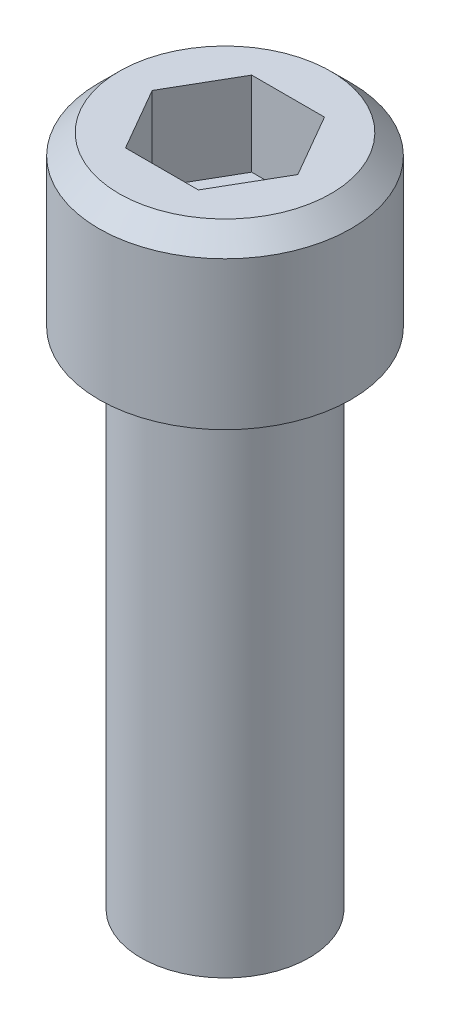
ISO-10303-21;
HEADER;
FILE_DESCRIPTION(('STEP AP214'),'2;1');
FILE_NAME('part.step','',(''),(''),'','','');
FILE_SCHEMA(('AUTOMOTIVE_DESIGN { 1 0 10303 214 1 1 1 1 }'));
ENDSEC;
DATA;
#1=APPLICATION_CONTEXT('core data for automotive mechanical design processes');
#2=APPLICATION_PROTOCOL_DEFINITION('international standard','automotive_design',2000,#1);
#3=PRODUCT_CONTEXT('',#1,'mechanical');
#4=PRODUCT('Part','Part','',(#3));
#5=PRODUCT_RELATED_PRODUCT_CATEGORY('part','',(#4));
#6=PRODUCT_DEFINITION_FORMATION('','',#4);
#7=PRODUCT_DEFINITION_CONTEXT('part definition',#1,'design');
#8=PRODUCT_DEFINITION('design','',#6,#7);
#9=PRODUCT_DEFINITION_SHAPE('','',#8);
#10=(LENGTH_UNIT() NAMED_UNIT(*) SI_UNIT(.MILLI.,.METRE.));
#11=(NAMED_UNIT(*) PLANE_ANGLE_UNIT() SI_UNIT($,.RADIAN.));
#12=(NAMED_UNIT(*) SI_UNIT($,.STERADIAN.) SOLID_ANGLE_UNIT());
#13=UNCERTAINTY_MEASURE_WITH_UNIT(LENGTH_MEASURE(1.E-05),#10,'distance_accuracy_value','');
#14=(GEOMETRIC_REPRESENTATION_CONTEXT(3) GLOBAL_UNCERTAINTY_ASSIGNED_CONTEXT((#13)) GLOBAL_UNIT_ASSIGNED_CONTEXT((#10,
#11,#12)) REPRESENTATION_CONTEXT('',''));
#15=CARTESIAN_POINT('',(0.,0.,0.));
#16=DIRECTION('',(0.,0.,1.));
#17=DIRECTION('',(1.,0.,0.));
#18=AXIS2_PLACEMENT_3D('',#15,#16,#17);
#19=CARTESIAN_POINT('',(0.,0.,0.));
#20=DIRECTION('',(0.,-1.,0.));
#21=DIRECTION('',(0.,0.,-1.));
#22=AXIS2_PLACEMENT_3D('',#19,#20,#21);
#23=CYLINDRICAL_SURFACE('',#22,9.525);
#24=CARTESIAN_POINT('',(0.,11.176,0.));
#25=DIRECTION('',(0.,1.,0.));
#26=DIRECTION('',(0.,0.,1.));
#27=AXIS2_PLACEMENT_3D('',#24,#25,#26);
#28=CIRCLE('',#27,9.525);
#29=CARTESIAN_POINT('',(0.,11.176,9.525));
#30=VERTEX_POINT('',#29);
#31=EDGE_CURVE('E42',#30,#30,#28,.F.);
#32=ORIENTED_EDGE('',*,*,#31,.T.);
#33=EDGE_LOOP('',(#32));
#34=FACE_BOUND('',#33,.T.);
#35=CARTESIAN_POINT('',(0.,0.,0.));
#36=DIRECTION('',(0.,-1.,0.));
#37=DIRECTION('',(0.,0.,-1.));
#38=AXIS2_PLACEMENT_3D('',#35,#36,#37);
#39=CIRCLE('',#38,9.525);
#40=CARTESIAN_POINT('',(0.,0.,-9.525));
#41=VERTEX_POINT('',#40);
#42=EDGE_CURVE('E137',#41,#41,#39,.T.);
#43=ORIENTED_EDGE('',*,*,#42,.F.);
#44=EDGE_LOOP('',(#43));
#45=FACE_BOUND('',#44,.T.);
#46=ADVANCED_FACE('F34',(#34,#45),#23,.T.);
#47=CARTESIAN_POINT('',(9.525,12.7,0.));
#48=DIRECTION('',(0.,1.,0.));
#49=DIRECTION('',(0.,0.,1.));
#50=AXIS2_PLACEMENT_3D('',#47,#48,#49);
#51=PLANE('',#50);
#52=CARTESIAN_POINT('',(0.,12.7,0.));
#53=DIRECTION('',(0.,1.,0.));
#54=DIRECTION('',(0.,0.,1.));
#55=AXIS2_PLACEMENT_3D('',#52,#53,#54);
#56=CIRCLE('',#55,8.00099999999999);
#57=CARTESIAN_POINT('',(0.,12.7,8.00099999999999));
#58=VERTEX_POINT('',#57);
#59=EDGE_CURVE('E11',#58,#58,#56,.T.);
#60=ORIENTED_EDGE('',*,*,#59,.T.);
#61=EDGE_LOOP('',(#60));
#62=FACE_BOUND('',#61,.T.);
#63=DIRECTION('',(1.,0.,0.));
#64=VECTOR('',#63,1.);
#65=CARTESIAN_POINT('',(-2.74963065701559,12.7,4.7625));
#66=LINE('',#65,#64);
#67=CARTESIAN_POINT('',(-2.74963065701559,12.7,4.7625));
#68=VERTEX_POINT('',#67);
#69=CARTESIAN_POINT('',(2.74963065701559,12.7,4.7625));
#70=VERTEX_POINT('',#69);
#71=EDGE_CURVE('E49',#68,#70,#66,.T.);
#72=ORIENTED_EDGE('',*,*,#71,.F.);
#73=DIRECTION('',(0.5,0.,0.866025403784439));
#74=VECTOR('',#73,1.);
#75=CARTESIAN_POINT('',(-5.49926131403118,12.7,0.));
#76=LINE('',#75,#74);
#77=CARTESIAN_POINT('',(-5.49926131403118,12.7,0.));
#78=VERTEX_POINT('',#77);
#79=EDGE_CURVE('E133',#78,#68,#76,.T.);
#80=ORIENTED_EDGE('',*,*,#79,.F.);
#81=DIRECTION('',(0.5,0.,-0.866025403784439));
#82=VECTOR('',#81,1.);
#83=CARTESIAN_POINT('',(-5.49926131403118,12.7,0.));
#84=LINE('',#83,#82);
#85=CARTESIAN_POINT('',(-2.74963065701559,12.7,-4.7625));
#86=VERTEX_POINT('',#85);
#87=EDGE_CURVE('E131',#78,#86,#84,.T.);
#88=ORIENTED_EDGE('',*,*,#87,.T.);
#89=DIRECTION('',(1.,0.,0.));
#90=VECTOR('',#89,1.);
#91=CARTESIAN_POINT('',(-2.74963065701559,12.7,-4.7625));
#92=LINE('',#91,#90);
#93=CARTESIAN_POINT('',(2.74963065701559,12.7,-4.7625));
#94=VERTEX_POINT('',#93);
#95=EDGE_CURVE('E108',#86,#94,#92,.T.);
#96=ORIENTED_EDGE('',*,*,#95,.T.);
#97=DIRECTION('',(-0.5,0.,-0.866025403784439));
#98=VECTOR('',#97,1.);
#99=CARTESIAN_POINT('',(5.49926131403118,12.7,0.));
#100=LINE('',#99,#98);
#101=CARTESIAN_POINT('',(5.49926131403118,12.7,0.));
#102=VERTEX_POINT('',#101);
#103=EDGE_CURVE('E127',#102,#94,#100,.T.);
#104=ORIENTED_EDGE('',*,*,#103,.F.);
#105=DIRECTION('',(-0.5,0.,0.866025403784439));
#106=VECTOR('',#105,1.);
#107=CARTESIAN_POINT('',(5.49926131403118,12.7,0.));
#108=LINE('',#107,#106);
#109=EDGE_CURVE('E124',#102,#70,#108,.T.);
#110=ORIENTED_EDGE('',*,*,#109,.T.);
#111=EDGE_LOOP('',(#72,#80,#88,#96,#104,#110));
#112=FACE_BOUND('',#111,.T.);
#113=ADVANCED_FACE('F164',(#62,#112),#51,.T.);
#114=CARTESIAN_POINT('',(0.,-38.1,0.));
#115=DIRECTION('',(0.,-1.,0.));
#116=DIRECTION('',(0.,0.,-1.));
#117=AXIS2_PLACEMENT_3D('',#114,#115,#116);
#118=PLANE('',#117);
#119=CARTESIAN_POINT('',(0.,-38.1,0.));
#120=DIRECTION('',(0.,-1.,0.));
#121=DIRECTION('',(0.,0.,-1.));
#122=AXIS2_PLACEMENT_3D('',#119,#120,#121);
#123=CIRCLE('',#122,6.35);
#124=CARTESIAN_POINT('',(0.,-38.1,-6.35));
#125=VERTEX_POINT('',#124);
#126=EDGE_CURVE('E148',#125,#125,#123,.T.);
#127=ORIENTED_EDGE('',*,*,#126,.T.);
#128=EDGE_LOOP('',(#127));
#129=FACE_BOUND('',#128,.T.);
#130=ADVANCED_FACE('F168',(#129),#118,.T.);
#131=CARTESIAN_POINT('',(0.,0.,0.));
#132=DIRECTION('',(0.,-1.,0.));
#133=DIRECTION('',(0.,0.,-1.));
#134=AXIS2_PLACEMENT_3D('',#131,#132,#133);
#135=CYLINDRICAL_SURFACE('',#134,6.35);
#136=CARTESIAN_POINT('',(0.,0.,0.));
#137=DIRECTION('',(0.,-1.,0.));
#138=DIRECTION('',(0.,0.,-1.));
#139=AXIS2_PLACEMENT_3D('',#136,#137,#138);
#140=CIRCLE('',#139,6.35);
#141=CARTESIAN_POINT('',(0.,0.,-6.35));
#142=VERTEX_POINT('',#141);
#143=EDGE_CURVE('E145',#142,#142,#140,.T.);
#144=ORIENTED_EDGE('',*,*,#143,.T.);
#145=EDGE_LOOP('',(#144));
#146=FACE_BOUND('',#145,.T.);
#147=ORIENTED_EDGE('',*,*,#126,.F.);
#148=EDGE_LOOP('',(#147));
#149=FACE_BOUND('',#148,.T.);
#150=ADVANCED_FACE('F174',(#146,#149),#135,.T.);
#151=CARTESIAN_POINT('',(6.35,0.,0.));
#152=DIRECTION('',(0.,-1.,0.));
#153=DIRECTION('',(0.,0.,-1.));
#154=AXIS2_PLACEMENT_3D('',#151,#152,#153);
#155=PLANE('',#154);
#156=ORIENTED_EDGE('',*,*,#42,.T.);
#157=EDGE_LOOP('',(#156));
#158=FACE_BOUND('',#157,.T.);
#159=ORIENTED_EDGE('',*,*,#143,.F.);
#160=EDGE_LOOP('',(#159));
#161=FACE_BOUND('',#160,.T.);
#162=ADVANCED_FACE('F178',(#158,#161),#155,.T.);
#163=CARTESIAN_POINT('',(-2.74963065701559,6.35,4.7625));
#164=DIRECTION('',(0.,0.,1.));
#165=DIRECTION('',(1.,0.,0.));
#166=AXIS2_PLACEMENT_3D('',#163,#164,#165);
#167=PLANE('',#166);
#168=ORIENTED_EDGE('',*,*,#71,.T.);
#169=DIRECTION('',(0.,1.,0.));
#170=VECTOR('',#169,1.);
#171=CARTESIAN_POINT('',(2.74963065701559,6.35,4.7625));
#172=LINE('',#171,#170);
#173=CARTESIAN_POINT('',(2.74963065701559,6.35,4.7625));
#174=VERTEX_POINT('',#173);
#175=EDGE_CURVE('E122',#174,#70,#172,.T.);
#176=ORIENTED_EDGE('',*,*,#175,.F.);
#177=DIRECTION('',(1.,0.,0.));
#178=VECTOR('',#177,1.);
#179=CARTESIAN_POINT('',(-2.74963065701559,6.35,4.7625));
#180=LINE('',#179,#178);
#181=CARTESIAN_POINT('',(-2.74963065701559,6.35,4.7625));
#182=VERTEX_POINT('',#181);
#183=EDGE_CURVE('E135',#182,#174,#180,.T.);
#184=ORIENTED_EDGE('',*,*,#183,.F.);
#185=DIRECTION('',(0.,1.,0.));
#186=VECTOR('',#185,1.);
#187=CARTESIAN_POINT('',(-2.74963065701559,6.35,4.7625));
#188=LINE('',#187,#186);
#189=EDGE_CURVE('E57',#182,#68,#188,.T.);
#190=ORIENTED_EDGE('',*,*,#189,.T.);
#191=EDGE_LOOP('',(#168,#176,#184,#190));
#192=FACE_BOUND('',#191,.T.);
#193=ADVANCED_FACE('F182',(#192),#167,.F.);
#194=CARTESIAN_POINT('',(-5.49926131403118,6.35,0.));
#195=DIRECTION('',(-0.866025403784439,0.,0.5));
#196=DIRECTION('',(0.5,0.,0.866025403784439));
#197=AXIS2_PLACEMENT_3D('',#194,#195,#196);
#198=PLANE('',#197);
#199=ORIENTED_EDGE('',*,*,#79,.T.);
#200=ORIENTED_EDGE('',*,*,#189,.F.);
#201=DIRECTION('',(0.5,0.,0.866025403784439));
#202=VECTOR('',#201,1.);
#203=CARTESIAN_POINT('',(-5.49926131403118,6.35,0.));
#204=LINE('',#203,#202);
#205=CARTESIAN_POINT('',(-5.49926131403118,6.35,0.));
#206=VERTEX_POINT('',#205);
#207=EDGE_CURVE('E101',#206,#182,#204,.T.);
#208=ORIENTED_EDGE('',*,*,#207,.F.);
#209=DIRECTION('',(0.,1.,0.));
#210=VECTOR('',#209,1.);
#211=CARTESIAN_POINT('',(-5.49926131403118,6.35,0.));
#212=LINE('',#211,#210);
#213=EDGE_CURVE('E97',#206,#78,#212,.T.);
#214=ORIENTED_EDGE('',*,*,#213,.T.);
#215=EDGE_LOOP('',(#199,#200,#208,#214));
#216=FACE_BOUND('',#215,.T.);
#217=ADVANCED_FACE('F186',(#216),#198,.F.);
#218=CARTESIAN_POINT('',(-5.49926131403118,6.35,0.));
#219=DIRECTION('',(0.866025403784439,0.,0.5));
#220=DIRECTION('',(0.5,0.,-0.866025403784439));
#221=AXIS2_PLACEMENT_3D('',#218,#219,#220);
#222=PLANE('',#221);
#223=ORIENTED_EDGE('',*,*,#87,.F.);
#224=ORIENTED_EDGE('',*,*,#213,.F.);
#225=DIRECTION('',(0.5,0.,-0.866025403784439));
#226=VECTOR('',#225,1.);
#227=CARTESIAN_POINT('',(-5.49926131403118,6.35,0.));
#228=LINE('',#227,#226);
#229=CARTESIAN_POINT('',(-2.74963065701559,6.35,-4.7625));
#230=VERTEX_POINT('',#229);
#231=EDGE_CURVE('E91',#206,#230,#228,.T.);
#232=ORIENTED_EDGE('',*,*,#231,.T.);
#233=DIRECTION('',(0.,1.,0.));
#234=VECTOR('',#233,1.);
#235=CARTESIAN_POINT('',(-2.74963065701559,6.35,-4.7625));
#236=LINE('',#235,#234);
#237=EDGE_CURVE('E95',#230,#86,#236,.T.);
#238=ORIENTED_EDGE('',*,*,#237,.T.);
#239=EDGE_LOOP('',(#223,#224,#232,#238));
#240=FACE_BOUND('',#239,.T.);
#241=ADVANCED_FACE('F94',(#240),#222,.T.);
#242=CARTESIAN_POINT('',(-2.74963065701559,6.35,-4.7625));
#243=DIRECTION('',(0.,0.,1.));
#244=DIRECTION('',(1.,0.,0.));
#245=AXIS2_PLACEMENT_3D('',#242,#243,#244);
#246=PLANE('',#245);
#247=ORIENTED_EDGE('',*,*,#95,.F.);
#248=ORIENTED_EDGE('',*,*,#237,.F.);
#249=DIRECTION('',(1.,0.,0.));
#250=VECTOR('',#249,1.);
#251=CARTESIAN_POINT('',(-2.74963065701559,6.35,-4.7625));
#252=LINE('',#251,#250);
#253=CARTESIAN_POINT('',(2.74963065701559,6.35,-4.7625));
#254=VERTEX_POINT('',#253);
#255=EDGE_CURVE('E102',#230,#254,#252,.T.);
#256=ORIENTED_EDGE('',*,*,#255,.T.);
#257=DIRECTION('',(0.,1.,0.));
#258=VECTOR('',#257,1.);
#259=CARTESIAN_POINT('',(2.74963065701559,6.35,-4.7625));
#260=LINE('',#259,#258);
#261=EDGE_CURVE('E110',#254,#94,#260,.T.);
#262=ORIENTED_EDGE('',*,*,#261,.T.);
#263=EDGE_LOOP('',(#247,#248,#256,#262));
#264=FACE_BOUND('',#263,.T.);
#265=ADVANCED_FACE('F105',(#264),#246,.T.);
#266=CARTESIAN_POINT('',(5.49926131403118,6.35,0.));
#267=DIRECTION('',(0.866025403784439,0.,-0.5));
#268=DIRECTION('',(-0.5,0.,-0.866025403784439));
#269=AXIS2_PLACEMENT_3D('',#266,#267,#268);
#270=PLANE('',#269);
#271=ORIENTED_EDGE('',*,*,#103,.T.);
#272=ORIENTED_EDGE('',*,*,#261,.F.);
#273=DIRECTION('',(-0.5,0.,-0.866025403784439));
#274=VECTOR('',#273,1.);
#275=CARTESIAN_POINT('',(5.49926131403118,6.35,0.));
#276=LINE('',#275,#274);
#277=CARTESIAN_POINT('',(5.49926131403118,6.35,0.));
#278=VERTEX_POINT('',#277);
#279=EDGE_CURVE('E116',#278,#254,#276,.T.);
#280=ORIENTED_EDGE('',*,*,#279,.F.);
#281=DIRECTION('',(0.,1.,0.));
#282=VECTOR('',#281,1.);
#283=CARTESIAN_POINT('',(5.49926131403118,6.35,0.));
#284=LINE('',#283,#282);
#285=EDGE_CURVE('E140',#278,#102,#284,.T.);
#286=ORIENTED_EDGE('',*,*,#285,.T.);
#287=EDGE_LOOP('',(#271,#272,#280,#286));
#288=FACE_BOUND('',#287,.T.);
#289=ADVANCED_FACE('F189',(#288),#270,.F.);
#290=CARTESIAN_POINT('',(5.49926131403118,6.35,0.));
#291=DIRECTION('',(-0.866025403784439,0.,-0.5));
#292=DIRECTION('',(-0.5,0.,0.866025403784439));
#293=AXIS2_PLACEMENT_3D('',#290,#291,#292);
#294=PLANE('',#293);
#295=ORIENTED_EDGE('',*,*,#109,.F.);
#296=ORIENTED_EDGE('',*,*,#285,.F.);
#297=DIRECTION('',(-0.5,0.,0.866025403784439));
#298=VECTOR('',#297,1.);
#299=CARTESIAN_POINT('',(5.49926131403118,6.35,0.));
#300=LINE('',#299,#298);
#301=EDGE_CURVE('E83',#278,#174,#300,.T.);
#302=ORIENTED_EDGE('',*,*,#301,.T.);
#303=ORIENTED_EDGE('',*,*,#175,.T.);
#304=EDGE_LOOP('',(#295,#296,#302,#303));
#305=FACE_BOUND('',#304,.T.);
#306=ADVANCED_FACE('F160',(#305),#294,.T.);
#307=CARTESIAN_POINT('',(2.74963065701559,6.35,4.7625));
#308=DIRECTION('',(0.,-1.,0.));
#309=DIRECTION('',(0.,0.,-1.));
#310=AXIS2_PLACEMENT_3D('',#307,#308,#309);
#311=PLANE('',#310);
#312=ORIENTED_EDGE('',*,*,#183,.T.);
#313=ORIENTED_EDGE('',*,*,#301,.F.);
#314=ORIENTED_EDGE('',*,*,#279,.T.);
#315=ORIENTED_EDGE('',*,*,#255,.F.);
#316=ORIENTED_EDGE('',*,*,#231,.F.);
#317=ORIENTED_EDGE('',*,*,#207,.T.);
#318=EDGE_LOOP('',(#312,#313,#314,#315,#316,#317));
#319=FACE_BOUND('',#318,.T.);
#320=ADVANCED_FACE('F114',(#319),#311,.F.);
#321=CARTESIAN_POINT('',(0.,11.176,0.));
#322=DIRECTION('',(0.,-1.,0.));
#323=DIRECTION('',(0.,0.,-1.));
#324=AXIS2_PLACEMENT_3D('',#321,#322,#323);
#325=CONICAL_SURFACE('',#324,9.525,0.785398163397443);
#326=ORIENTED_EDGE('',*,*,#59,.F.);
#327=EDGE_LOOP('',(#326));
#328=FACE_BOUND('',#327,.T.);
#329=ORIENTED_EDGE('',*,*,#31,.F.);
#330=EDGE_LOOP('',(#329));
#331=FACE_BOUND('',#330,.T.);
#332=ADVANCED_FACE('F36',(#328,#331),#325,.T.);
#333=CLOSED_SHELL('',(#46,#113,#130,#150,#162,#193,#217,#241,#265,#289,#306,#320,#332));
#334=MANIFOLD_SOLID_BREP('B2',#333);
#335=ADVANCED_BREP_SHAPE_REPRESENTATION('',(#18,#334),#14);
#336=SHAPE_DEFINITION_REPRESENTATION(#9,#335);
ENDSEC;
END-ISO-10303-21;
